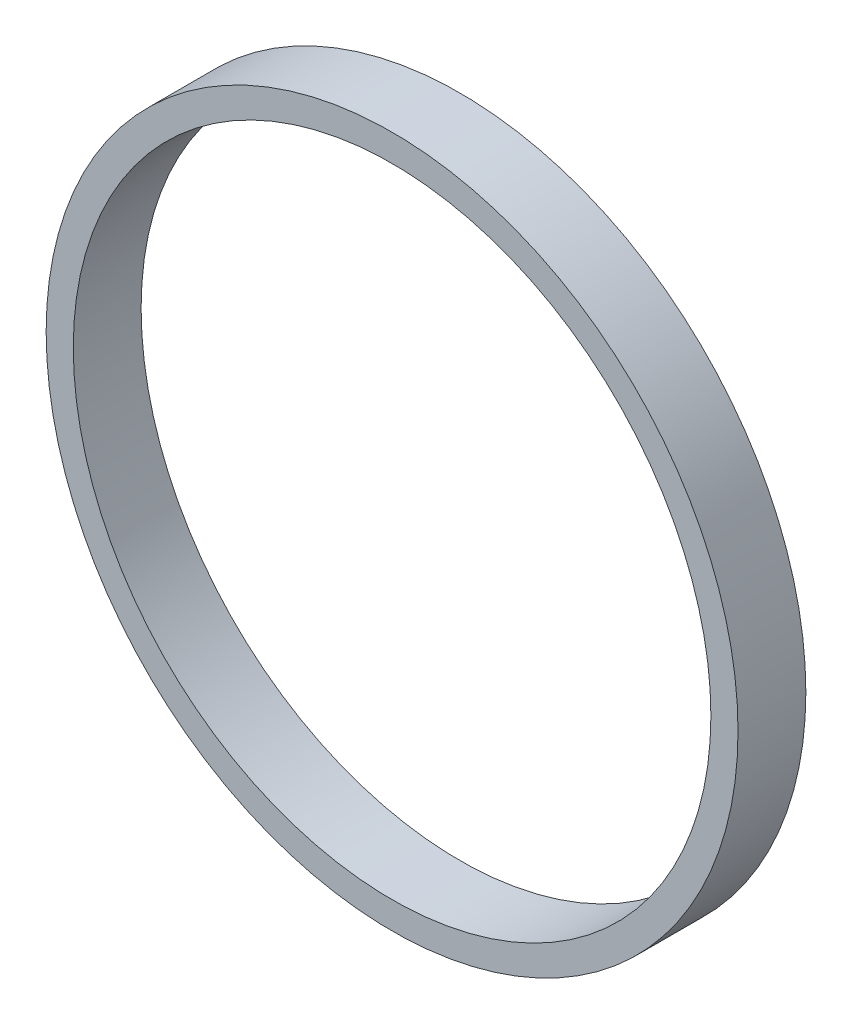
ISO-10303-21;
HEADER;
FILE_DESCRIPTION(('STEP AP214'),'2;1');
FILE_NAME('part.step','',(''),(''),'','','');
FILE_SCHEMA(('AUTOMOTIVE_DESIGN { 1 0 10303 214 1 1 1 1 }'));
ENDSEC;
DATA;
#1=APPLICATION_CONTEXT('core data for automotive mechanical design processes');
#2=APPLICATION_PROTOCOL_DEFINITION('international standard','automotive_design',2000,#1);
#3=PRODUCT_CONTEXT('',#1,'mechanical');
#4=PRODUCT('Part','Part','',(#3));
#5=PRODUCT_RELATED_PRODUCT_CATEGORY('part','',(#4));
#6=PRODUCT_DEFINITION_FORMATION('','',#4);
#7=PRODUCT_DEFINITION_CONTEXT('part definition',#1,'design');
#8=PRODUCT_DEFINITION('design','',#6,#7);
#9=PRODUCT_DEFINITION_SHAPE('','',#8);
#10=(LENGTH_UNIT() NAMED_UNIT(*) SI_UNIT(.MILLI.,.METRE.));
#11=(NAMED_UNIT(*) PLANE_ANGLE_UNIT() SI_UNIT($,.RADIAN.));
#12=(NAMED_UNIT(*) SI_UNIT($,.STERADIAN.) SOLID_ANGLE_UNIT());
#13=UNCERTAINTY_MEASURE_WITH_UNIT(LENGTH_MEASURE(1.E-05),#10,'distance_accuracy_value','');
#14=(GEOMETRIC_REPRESENTATION_CONTEXT(3) GLOBAL_UNCERTAINTY_ASSIGNED_CONTEXT((#13)) GLOBAL_UNIT_ASSIGNED_CONTEXT((#10,
#11,#12)) REPRESENTATION_CONTEXT('',''));
#15=CARTESIAN_POINT('',(0.,0.,0.));
#16=DIRECTION('',(0.,0.,1.));
#17=DIRECTION('',(1.,0.,0.));
#18=AXIS2_PLACEMENT_3D('',#15,#16,#17);
#19=CARTESIAN_POINT('',(0.,0.,277.5));
#20=DIRECTION('',(0.,0.,1.));
#21=DIRECTION('',(1.,0.,0.));
#22=AXIS2_PLACEMENT_3D('',#19,#20,#21);
#23=PLANE('',#22);
#24=CARTESIAN_POINT('',(0.,0.,277.5));
#25=DIRECTION('',(0.,0.,1.));
#26=DIRECTION('',(1.,0.,0.));
#27=AXIS2_PLACEMENT_3D('',#24,#25,#26);
#28=CIRCLE('',#27,51.);
#29=CARTESIAN_POINT('',(51.,0.,277.5));
#30=VERTEX_POINT('',#29);
#31=EDGE_CURVE('E10',#30,#30,#28,.T.);
#32=ORIENTED_EDGE('',*,*,#31,.T.);
#33=EDGE_LOOP('',(#32));
#34=FACE_BOUND('',#33,.T.);
#35=CARTESIAN_POINT('',(0.,0.,277.5));
#36=DIRECTION('',(0.,0.,1.));
#37=DIRECTION('',(1.,0.,0.));
#38=AXIS2_PLACEMENT_3D('',#35,#36,#37);
#39=CIRCLE('',#38,47.);
#40=CARTESIAN_POINT('',(47.,0.,277.5));
#41=VERTEX_POINT('',#40);
#42=EDGE_CURVE('E42',#41,#41,#39,.T.);
#43=ORIENTED_EDGE('',*,*,#42,.F.);
#44=EDGE_LOOP('',(#43));
#45=FACE_BOUND('',#44,.T.);
#46=ADVANCED_FACE('F31',(#34,#45),#23,.T.);
#47=CARTESIAN_POINT('',(0.,0.,267.5));
#48=DIRECTION('',(0.,0.,1.));
#49=DIRECTION('',(1.,0.,0.));
#50=AXIS2_PLACEMENT_3D('',#47,#48,#49);
#51=PLANE('',#50);
#52=CARTESIAN_POINT('',(0.,0.,267.5));
#53=DIRECTION('',(0.,0.,1.));
#54=DIRECTION('',(1.,0.,0.));
#55=AXIS2_PLACEMENT_3D('',#52,#53,#54);
#56=CIRCLE('',#55,51.);
#57=CARTESIAN_POINT('',(51.,0.,267.5));
#58=VERTEX_POINT('',#57);
#59=EDGE_CURVE('E35',#58,#58,#56,.T.);
#60=ORIENTED_EDGE('',*,*,#59,.F.);
#61=EDGE_LOOP('',(#60));
#62=FACE_BOUND('',#61,.T.);
#63=CARTESIAN_POINT('',(0.,0.,267.5));
#64=DIRECTION('',(0.,0.,1.));
#65=DIRECTION('',(1.,0.,0.));
#66=AXIS2_PLACEMENT_3D('',#63,#64,#65);
#67=CIRCLE('',#66,47.);
#68=CARTESIAN_POINT('',(47.,0.,267.5));
#69=VERTEX_POINT('',#68);
#70=EDGE_CURVE('E44',#69,#69,#67,.T.);
#71=ORIENTED_EDGE('',*,*,#70,.T.);
#72=EDGE_LOOP('',(#71));
#73=FACE_BOUND('',#72,.T.);
#74=ADVANCED_FACE('F54',(#62,#73),#51,.F.);
#75=CARTESIAN_POINT('',(0.,0.,277.5));
#76=DIRECTION('',(0.,0.,-1.));
#77=DIRECTION('',(-1.,0.,0.));
#78=AXIS2_PLACEMENT_3D('',#75,#76,#77);
#79=CYLINDRICAL_SURFACE('',#78,51.);
#80=ORIENTED_EDGE('',*,*,#31,.F.);
#81=EDGE_LOOP('',(#80));
#82=FACE_BOUND('',#81,.T.);
#83=ORIENTED_EDGE('',*,*,#59,.T.);
#84=EDGE_LOOP('',(#83));
#85=FACE_BOUND('',#84,.T.);
#86=ADVANCED_FACE('F33',(#82,#85),#79,.T.);
#87=CARTESIAN_POINT('',(0.,0.,277.5));
#88=DIRECTION('',(0.,0.,-1.));
#89=DIRECTION('',(-1.,0.,0.));
#90=AXIS2_PLACEMENT_3D('',#87,#88,#89);
#91=CYLINDRICAL_SURFACE('',#90,47.);
#92=ORIENTED_EDGE('',*,*,#42,.T.);
#93=EDGE_LOOP('',(#92));
#94=FACE_BOUND('',#93,.T.);
#95=ORIENTED_EDGE('',*,*,#70,.F.);
#96=EDGE_LOOP('',(#95));
#97=FACE_BOUND('',#96,.T.);
#98=ADVANCED_FACE('F50',(#94,#97),#91,.F.);
#99=CLOSED_SHELL('',(#46,#74,#86,#98));
#100=MANIFOLD_SOLID_BREP('B2',#99);
#101=ADVANCED_BREP_SHAPE_REPRESENTATION('',(#18,#100),#14);
#102=SHAPE_DEFINITION_REPRESENTATION(#9,#101);
ENDSEC;
END-ISO-10303-21;
